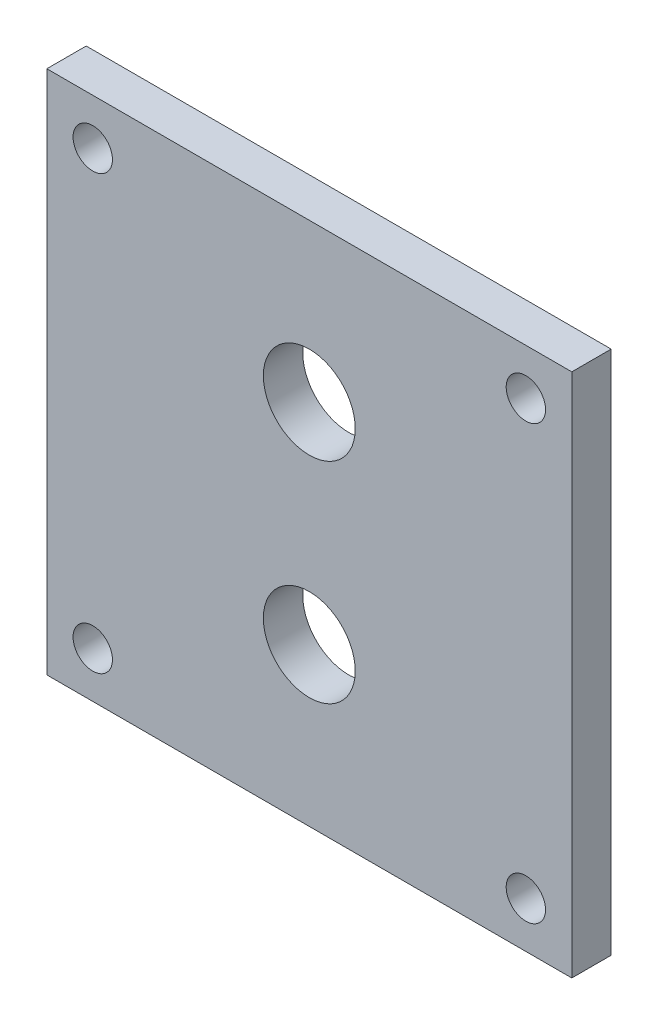
ISO-10303-21;
HEADER;
FILE_DESCRIPTION(('STEP AP214'),'2;1');
FILE_NAME('part.step','',(''),(''),'','','');
FILE_SCHEMA(('AUTOMOTIVE_DESIGN { 1 0 10303 214 1 1 1 1 }'));
ENDSEC;
DATA;
#1=APPLICATION_CONTEXT('core data for automotive mechanical design processes');
#2=APPLICATION_PROTOCOL_DEFINITION('international standard','automotive_design',2000,#1);
#3=PRODUCT_CONTEXT('',#1,'mechanical');
#4=PRODUCT('Part','Part','',(#3));
#5=PRODUCT_RELATED_PRODUCT_CATEGORY('part','',(#4));
#6=PRODUCT_DEFINITION_FORMATION('','',#4);
#7=PRODUCT_DEFINITION_CONTEXT('part definition',#1,'design');
#8=PRODUCT_DEFINITION('design','',#6,#7);
#9=PRODUCT_DEFINITION_SHAPE('','',#8);
#10=(LENGTH_UNIT() NAMED_UNIT(*) SI_UNIT(.MILLI.,.METRE.));
#11=(NAMED_UNIT(*) PLANE_ANGLE_UNIT() SI_UNIT($,.RADIAN.));
#12=(NAMED_UNIT(*) SI_UNIT($,.STERADIAN.) SOLID_ANGLE_UNIT());
#13=UNCERTAINTY_MEASURE_WITH_UNIT(LENGTH_MEASURE(1.E-05),#10,'distance_accuracy_value','');
#14=(GEOMETRIC_REPRESENTATION_CONTEXT(3) GLOBAL_UNCERTAINTY_ASSIGNED_CONTEXT((#13)) GLOBAL_UNIT_ASSIGNED_CONTEXT((#10,
#11,#12)) REPRESENTATION_CONTEXT('',''));
#15=CARTESIAN_POINT('',(0.,0.,0.));
#16=DIRECTION('',(0.,0.,1.));
#17=DIRECTION('',(1.,0.,0.));
#18=AXIS2_PLACEMENT_3D('',#15,#16,#17);
#19=CARTESIAN_POINT('',(63.5,63.5,9.525));
#20=DIRECTION('',(-1.,0.,0.));
#21=DIRECTION('',(0.,-1.,0.));
#22=AXIS2_PLACEMENT_3D('',#19,#20,#21);
#23=PLANE('',#22);
#24=DIRECTION('',(0.,1.,0.));
#25=VECTOR('',#24,1.);
#26=CARTESIAN_POINT('',(63.5,63.5,0.));
#27=LINE('',#26,#25);
#28=CARTESIAN_POINT('',(63.5,-63.5,0.));
#29=VERTEX_POINT('',#28);
#30=CARTESIAN_POINT('',(63.5,63.5,0.));
#31=VERTEX_POINT('',#30);
#32=EDGE_CURVE('E95',#29,#31,#27,.T.);
#33=ORIENTED_EDGE('',*,*,#32,.T.);
#34=DIRECTION('',(0.,0.,-1.));
#35=VECTOR('',#34,1.);
#36=CARTESIAN_POINT('',(63.5,63.5,9.525));
#37=LINE('',#36,#35);
#38=CARTESIAN_POINT('',(63.5,63.5,9.525));
#39=VERTEX_POINT('',#38);
#40=EDGE_CURVE('E11',#39,#31,#37,.T.);
#41=ORIENTED_EDGE('',*,*,#40,.F.);
#42=DIRECTION('',(0.,1.,0.));
#43=VECTOR('',#42,1.);
#44=CARTESIAN_POINT('',(63.5,63.5,9.525));
#45=LINE('',#44,#43);
#46=CARTESIAN_POINT('',(63.5,-63.5,9.525));
#47=VERTEX_POINT('',#46);
#48=EDGE_CURVE('E83',#47,#39,#45,.T.);
#49=ORIENTED_EDGE('',*,*,#48,.F.);
#50=DIRECTION('',(0.,0.,-1.));
#51=VECTOR('',#50,1.);
#52=CARTESIAN_POINT('',(63.5,-63.5,9.525));
#53=LINE('',#52,#51);
#54=EDGE_CURVE('E91',#47,#29,#53,.T.);
#55=ORIENTED_EDGE('',*,*,#54,.T.);
#56=EDGE_LOOP('',(#33,#41,#49,#55));
#57=FACE_BOUND('',#56,.T.);
#58=ADVANCED_FACE('F32',(#57),#23,.F.);
#59=CARTESIAN_POINT('',(-63.5,63.5,9.525));
#60=DIRECTION('',(0.,-1.,0.));
#61=DIRECTION('',(0.,0.,-1.));
#62=AXIS2_PLACEMENT_3D('',#59,#60,#61);
#63=PLANE('',#62);
#64=DIRECTION('',(-1.,0.,0.));
#65=VECTOR('',#64,1.);
#66=CARTESIAN_POINT('',(-63.5,63.5,0.));
#67=LINE('',#66,#65);
#68=CARTESIAN_POINT('',(-63.5,63.5,0.));
#69=VERTEX_POINT('',#68);
#70=EDGE_CURVE('E87',#31,#69,#67,.T.);
#71=ORIENTED_EDGE('',*,*,#70,.T.);
#72=DIRECTION('',(0.,0.,-1.));
#73=VECTOR('',#72,1.);
#74=CARTESIAN_POINT('',(-63.5,63.5,9.525));
#75=LINE('',#74,#73);
#76=CARTESIAN_POINT('',(-63.5,63.5,9.525));
#77=VERTEX_POINT('',#76);
#78=EDGE_CURVE('E40',#77,#69,#75,.T.);
#79=ORIENTED_EDGE('',*,*,#78,.F.);
#80=DIRECTION('',(-1.,0.,0.));
#81=VECTOR('',#80,1.);
#82=CARTESIAN_POINT('',(-63.5,63.5,9.525));
#83=LINE('',#82,#81);
#84=EDGE_CURVE('E78',#39,#77,#83,.T.);
#85=ORIENTED_EDGE('',*,*,#84,.F.);
#86=ORIENTED_EDGE('',*,*,#40,.T.);
#87=EDGE_LOOP('',(#71,#79,#85,#86));
#88=FACE_BOUND('',#87,.T.);
#89=ADVANCED_FACE('F86',(#88),#63,.F.);
#90=CARTESIAN_POINT('',(-63.5,63.5,9.525));
#91=DIRECTION('',(1.,0.,0.));
#92=DIRECTION('',(0.,1.,0.));
#93=AXIS2_PLACEMENT_3D('',#90,#91,#92);
#94=PLANE('',#93);
#95=DIRECTION('',(0.,-1.,0.));
#96=VECTOR('',#95,1.);
#97=CARTESIAN_POINT('',(-63.5,63.5,0.));
#98=LINE('',#97,#96);
#99=CARTESIAN_POINT('',(-63.5,-63.5,0.));
#100=VERTEX_POINT('',#99);
#101=EDGE_CURVE('E65',#69,#100,#98,.T.);
#102=ORIENTED_EDGE('',*,*,#101,.T.);
#103=DIRECTION('',(0.,0.,-1.));
#104=VECTOR('',#103,1.);
#105=CARTESIAN_POINT('',(-63.5,-63.5,9.525));
#106=LINE('',#105,#104);
#107=CARTESIAN_POINT('',(-63.5,-63.5,9.525));
#108=VERTEX_POINT('',#107);
#109=EDGE_CURVE('E88',#108,#100,#106,.T.);
#110=ORIENTED_EDGE('',*,*,#109,.F.);
#111=DIRECTION('',(0.,-1.,0.));
#112=VECTOR('',#111,1.);
#113=CARTESIAN_POINT('',(-63.5,63.5,9.525));
#114=LINE('',#113,#112);
#115=EDGE_CURVE('E81',#77,#108,#114,.T.);
#116=ORIENTED_EDGE('',*,*,#115,.F.);
#117=ORIENTED_EDGE('',*,*,#78,.T.);
#118=EDGE_LOOP('',(#102,#110,#116,#117));
#119=FACE_BOUND('',#118,.T.);
#120=ADVANCED_FACE('F89',(#119),#94,.F.);
#121=CARTESIAN_POINT('',(-63.5,-63.5,9.525));
#122=DIRECTION('',(0.,1.,0.));
#123=DIRECTION('',(0.,0.,1.));
#124=AXIS2_PLACEMENT_3D('',#121,#122,#123);
#125=PLANE('',#124);
#126=DIRECTION('',(1.,0.,0.));
#127=VECTOR('',#126,1.);
#128=CARTESIAN_POINT('',(-63.5,-63.5,0.));
#129=LINE('',#128,#127);
#130=EDGE_CURVE('E71',#100,#29,#129,.T.);
#131=ORIENTED_EDGE('',*,*,#130,.T.);
#132=ORIENTED_EDGE('',*,*,#54,.F.);
#133=DIRECTION('',(1.,0.,0.));
#134=VECTOR('',#133,1.);
#135=CARTESIAN_POINT('',(-63.5,-63.5,9.525));
#136=LINE('',#135,#134);
#137=EDGE_CURVE('E48',#108,#47,#136,.T.);
#138=ORIENTED_EDGE('',*,*,#137,.F.);
#139=ORIENTED_EDGE('',*,*,#109,.T.);
#140=EDGE_LOOP('',(#131,#132,#138,#139));
#141=FACE_BOUND('',#140,.T.);
#142=ADVANCED_FACE('F103',(#141),#125,.F.);
#143=CARTESIAN_POINT('',(0.,0.,9.525));
#144=DIRECTION('',(0.,0.,1.));
#145=DIRECTION('',(1.,0.,0.));
#146=AXIS2_PLACEMENT_3D('',#143,#144,#145);
#147=PLANE('',#146);
#148=CARTESIAN_POINT('',(52.3875,-52.3875,9.525));
#149=DIRECTION('',(0.,0.,1.));
#150=DIRECTION('',(1.,0.,0.));
#151=AXIS2_PLACEMENT_3D('',#148,#149,#150);
#152=CIRCLE('',#151,4.7625);
#153=CARTESIAN_POINT('',(47.625,-52.3875,9.525));
#154=VERTEX_POINT('',#153);
#155=EDGE_CURVE('E138',#154,#154,#152,.F.);
#156=ORIENTED_EDGE('',*,*,#155,.T.);
#157=EDGE_LOOP('',(#156));
#158=FACE_BOUND('',#157,.T.);
#159=CARTESIAN_POINT('',(52.3875,52.3875,9.525));
#160=DIRECTION('',(0.,0.,1.));
#161=DIRECTION('',(1.,0.,0.));
#162=AXIS2_PLACEMENT_3D('',#159,#160,#161);
#163=CIRCLE('',#162,4.7625);
#164=CARTESIAN_POINT('',(47.625,52.3875,9.525));
#165=VERTEX_POINT('',#164);
#166=EDGE_CURVE('E132',#165,#165,#163,.F.);
#167=ORIENTED_EDGE('',*,*,#166,.T.);
#168=EDGE_LOOP('',(#167));
#169=FACE_BOUND('',#168,.T.);
#170=CARTESIAN_POINT('',(-52.3875,-52.3875,9.525));
#171=DIRECTION('',(0.,0.,1.));
#172=DIRECTION('',(1.,0.,0.));
#173=AXIS2_PLACEMENT_3D('',#170,#171,#172);
#174=CIRCLE('',#173,4.7625);
#175=CARTESIAN_POINT('',(-57.15,-52.3875,9.525));
#176=VERTEX_POINT('',#175);
#177=EDGE_CURVE('E126',#176,#176,#174,.F.);
#178=ORIENTED_EDGE('',*,*,#177,.T.);
#179=EDGE_LOOP('',(#178));
#180=FACE_BOUND('',#179,.T.);
#181=CARTESIAN_POINT('',(-52.3875,52.3875,9.525));
#182=DIRECTION('',(0.,0.,1.));
#183=DIRECTION('',(1.,0.,0.));
#184=AXIS2_PLACEMENT_3D('',#181,#182,#183);
#185=CIRCLE('',#184,4.7625);
#186=CARTESIAN_POINT('',(-57.15,52.3875,9.525));
#187=VERTEX_POINT('',#186);
#188=EDGE_CURVE('E120',#187,#187,#185,.F.);
#189=ORIENTED_EDGE('',*,*,#188,.T.);
#190=EDGE_LOOP('',(#189));
#191=FACE_BOUND('',#190,.T.);
#192=CARTESIAN_POINT('',(0.,-25.4,9.525));
#193=DIRECTION('',(0.,0.,1.));
#194=DIRECTION('',(1.,0.,0.));
#195=AXIS2_PLACEMENT_3D('',#192,#193,#194);
#196=CIRCLE('',#195,11.1125);
#197=CARTESIAN_POINT('',(11.1125,-25.4,9.525));
#198=VERTEX_POINT('',#197);
#199=EDGE_CURVE('E114',#198,#198,#196,.F.);
#200=ORIENTED_EDGE('',*,*,#199,.T.);
#201=EDGE_LOOP('',(#200));
#202=FACE_BOUND('',#201,.T.);
#203=CARTESIAN_POINT('',(0.,25.4,9.525));
#204=DIRECTION('',(0.,0.,1.));
#205=DIRECTION('',(1.,0.,0.));
#206=AXIS2_PLACEMENT_3D('',#203,#204,#205);
#207=CIRCLE('',#206,11.1125);
#208=CARTESIAN_POINT('',(11.1125,25.4,9.525));
#209=VERTEX_POINT('',#208);
#210=EDGE_CURVE('E98',#209,#209,#207,.F.);
#211=ORIENTED_EDGE('',*,*,#210,.T.);
#212=EDGE_LOOP('',(#211));
#213=FACE_BOUND('',#212,.T.);
#214=ORIENTED_EDGE('',*,*,#48,.T.);
#215=ORIENTED_EDGE('',*,*,#84,.T.);
#216=ORIENTED_EDGE('',*,*,#115,.T.);
#217=ORIENTED_EDGE('',*,*,#137,.T.);
#218=EDGE_LOOP('',(#214,#215,#216,#217));
#219=FACE_BOUND('',#218,.T.);
#220=ADVANCED_FACE('F79',(#158,#169,#180,#191,#202,#213,#219),#147,.T.);
#221=CARTESIAN_POINT('',(0.,0.,0.));
#222=DIRECTION('',(0.,0.,1.));
#223=DIRECTION('',(1.,0.,0.));
#224=AXIS2_PLACEMENT_3D('',#221,#222,#223);
#225=PLANE('',#224);
#226=CARTESIAN_POINT('',(52.3875,-52.3875,0.));
#227=DIRECTION('',(0.,0.,-1.));
#228=DIRECTION('',(-1.,0.,0.));
#229=AXIS2_PLACEMENT_3D('',#226,#227,#228);
#230=CIRCLE('',#229,4.7625);
#231=CARTESIAN_POINT('',(47.625,-52.3875,0.));
#232=VERTEX_POINT('',#231);
#233=EDGE_CURVE('E141',#232,#232,#230,.T.);
#234=ORIENTED_EDGE('',*,*,#233,.F.);
#235=EDGE_LOOP('',(#234));
#236=FACE_BOUND('',#235,.T.);
#237=CARTESIAN_POINT('',(52.3875,52.3875,0.));
#238=DIRECTION('',(0.,0.,-1.));
#239=DIRECTION('',(1.,0.,0.));
#240=AXIS2_PLACEMENT_3D('',#237,#238,#239);
#241=CIRCLE('',#240,4.7625);
#242=CARTESIAN_POINT('',(47.625,52.3875,0.));
#243=VERTEX_POINT('',#242);
#244=EDGE_CURVE('E135',#243,#243,#241,.T.);
#245=ORIENTED_EDGE('',*,*,#244,.F.);
#246=EDGE_LOOP('',(#245));
#247=FACE_BOUND('',#246,.T.);
#248=CARTESIAN_POINT('',(-52.3875,-52.3875,0.));
#249=DIRECTION('',(0.,0.,-1.));
#250=DIRECTION('',(1.,0.,0.));
#251=AXIS2_PLACEMENT_3D('',#248,#249,#250);
#252=CIRCLE('',#251,4.7625);
#253=CARTESIAN_POINT('',(-57.15,-52.3875,0.));
#254=VERTEX_POINT('',#253);
#255=EDGE_CURVE('E129',#254,#254,#252,.T.);
#256=ORIENTED_EDGE('',*,*,#255,.F.);
#257=EDGE_LOOP('',(#256));
#258=FACE_BOUND('',#257,.T.);
#259=CARTESIAN_POINT('',(-52.3875,52.3875,0.));
#260=DIRECTION('',(0.,0.,-1.));
#261=DIRECTION('',(-1.,0.,0.));
#262=AXIS2_PLACEMENT_3D('',#259,#260,#261);
#263=CIRCLE('',#262,4.7625);
#264=CARTESIAN_POINT('',(-57.15,52.3875,0.));
#265=VERTEX_POINT('',#264);
#266=EDGE_CURVE('E123',#265,#265,#263,.T.);
#267=ORIENTED_EDGE('',*,*,#266,.F.);
#268=EDGE_LOOP('',(#267));
#269=FACE_BOUND('',#268,.T.);
#270=CARTESIAN_POINT('',(0.,-25.4,0.));
#271=DIRECTION('',(0.,0.,-1.));
#272=DIRECTION('',(-1.,0.,0.));
#273=AXIS2_PLACEMENT_3D('',#270,#271,#272);
#274=CIRCLE('',#273,11.1125);
#275=CARTESIAN_POINT('',(-11.1125,-25.4,0.));
#276=VERTEX_POINT('',#275);
#277=EDGE_CURVE('E117',#276,#276,#274,.T.);
#278=ORIENTED_EDGE('',*,*,#277,.F.);
#279=EDGE_LOOP('',(#278));
#280=FACE_BOUND('',#279,.T.);
#281=CARTESIAN_POINT('',(0.,25.4,0.));
#282=DIRECTION('',(0.,0.,-1.));
#283=DIRECTION('',(-1.,0.,0.));
#284=AXIS2_PLACEMENT_3D('',#281,#282,#283);
#285=CIRCLE('',#284,11.1125);
#286=CARTESIAN_POINT('',(-11.1125,25.4,0.));
#287=VERTEX_POINT('',#286);
#288=EDGE_CURVE('E111',#287,#287,#285,.T.);
#289=ORIENTED_EDGE('',*,*,#288,.F.);
#290=EDGE_LOOP('',(#289));
#291=FACE_BOUND('',#290,.T.);
#292=ORIENTED_EDGE('',*,*,#32,.F.);
#293=ORIENTED_EDGE('',*,*,#130,.F.);
#294=ORIENTED_EDGE('',*,*,#101,.F.);
#295=ORIENTED_EDGE('',*,*,#70,.F.);
#296=EDGE_LOOP('',(#292,#293,#294,#295));
#297=FACE_BOUND('',#296,.T.);
#298=ADVANCED_FACE('F106',(#236,#247,#258,#269,#280,#291,#297),#225,.F.);
#299=CARTESIAN_POINT('',(0.,25.4,40.955896423742));
#300=DIRECTION('',(0.,0.,-1.));
#301=DIRECTION('',(-1.,0.,0.));
#302=AXIS2_PLACEMENT_3D('',#299,#300,#301);
#303=CYLINDRICAL_SURFACE('',#302,11.1125);
#304=ORIENTED_EDGE('',*,*,#288,.T.);
#305=EDGE_LOOP('',(#304));
#306=FACE_BOUND('',#305,.T.);
#307=ORIENTED_EDGE('',*,*,#210,.F.);
#308=EDGE_LOOP('',(#307));
#309=FACE_BOUND('',#308,.T.);
#310=ADVANCED_FACE('F150',(#306,#309),#303,.F.);
#311=CARTESIAN_POINT('',(0.,-25.4,40.955896423742));
#312=DIRECTION('',(0.,0.,-1.));
#313=DIRECTION('',(-1.,0.,0.));
#314=AXIS2_PLACEMENT_3D('',#311,#312,#313);
#315=CYLINDRICAL_SURFACE('',#314,11.1125);
#316=ORIENTED_EDGE('',*,*,#277,.T.);
#317=EDGE_LOOP('',(#316));
#318=FACE_BOUND('',#317,.T.);
#319=ORIENTED_EDGE('',*,*,#199,.F.);
#320=EDGE_LOOP('',(#319));
#321=FACE_BOUND('',#320,.T.);
#322=ADVANCED_FACE('F164',(#318,#321),#315,.F.);
#323=CARTESIAN_POINT('',(-52.3875,52.3875,22.9953841816037));
#324=DIRECTION('',(0.,0.,-1.));
#325=DIRECTION('',(-1.,0.,0.));
#326=AXIS2_PLACEMENT_3D('',#323,#324,#325);
#327=CYLINDRICAL_SURFACE('',#326,4.7625);
#328=CARTESIAN_POINT('',(-57.15,52.3875,0.));
#329=CARTESIAN_POINT('',(-57.15,52.3875,0.0992187500000035));
#330=CARTESIAN_POINT('',(-57.15,52.3875,0.198437500000004));
#331=CARTESIAN_POINT('',(-57.15,52.3875,0.396875000000004));
#332=CARTESIAN_POINT('',(-57.15,52.3875,0.496093750000004));
#333=CARTESIAN_POINT('',(-57.15,52.3875,0.694531250000004));
#334=CARTESIAN_POINT('',(-57.15,52.3875,0.793750000000004));
#335=CARTESIAN_POINT('',(-57.15,52.3875,0.992187500000004));
#336=CARTESIAN_POINT('',(-57.15,52.3875,1.09140625));
#337=CARTESIAN_POINT('',(-57.15,52.3875,1.28984375));
#338=CARTESIAN_POINT('',(-57.15,52.3875,1.3890625));
#339=CARTESIAN_POINT('',(-57.15,52.3875,1.5875));
#340=CARTESIAN_POINT('',(-57.15,52.3875,1.68671875));
#341=CARTESIAN_POINT('',(-57.15,52.3875,1.88515625));
#342=CARTESIAN_POINT('',(-57.15,52.3875,1.984375));
#343=CARTESIAN_POINT('',(-57.15,52.3875,2.1828125));
#344=CARTESIAN_POINT('',(-57.15,52.3875,2.28203125000001));
#345=CARTESIAN_POINT('',(-57.15,52.3875,2.48046875));
#346=CARTESIAN_POINT('',(-57.15,52.3875,2.57968750000001));
#347=CARTESIAN_POINT('',(-57.15,52.3875,2.778125));
#348=CARTESIAN_POINT('',(-57.15,52.3875,2.87734375));
#349=CARTESIAN_POINT('',(-57.15,52.3875,3.07578125));
#350=CARTESIAN_POINT('',(-57.15,52.3875,3.175));
#351=CARTESIAN_POINT('',(-57.15,52.3875,3.3734375));
#352=CARTESIAN_POINT('',(-57.15,52.3875,3.47265625));
#353=CARTESIAN_POINT('',(-57.15,52.3875,3.67109375));
#354=CARTESIAN_POINT('',(-57.15,52.3875,3.7703125));
#355=CARTESIAN_POINT('',(-57.15,52.3875,3.96875));
#356=CARTESIAN_POINT('',(-57.15,52.3875,4.06796875));
#357=CARTESIAN_POINT('',(-57.15,52.3875,4.26640625));
#358=CARTESIAN_POINT('',(-57.15,52.3875,4.365625));
#359=CARTESIAN_POINT('',(-57.15,52.3875,4.5640625));
#360=CARTESIAN_POINT('',(-57.15,52.3875,4.66328125));
#361=CARTESIAN_POINT('',(-57.15,52.3875,4.86171875));
#362=CARTESIAN_POINT('',(-57.15,52.3875,4.9609375));
#363=CARTESIAN_POINT('',(-57.15,52.3875,5.159375));
#364=CARTESIAN_POINT('',(-57.15,52.3875,5.25859375));
#365=CARTESIAN_POINT('',(-57.15,52.3875,5.45703125));
#366=CARTESIAN_POINT('',(-57.15,52.3875,5.55625));
#367=CARTESIAN_POINT('',(-57.15,52.3875,5.7546875));
#368=CARTESIAN_POINT('',(-57.15,52.3875,5.85390625));
#369=CARTESIAN_POINT('',(-57.15,52.3875,6.05234375));
#370=CARTESIAN_POINT('',(-57.15,52.3875,6.1515625));
#371=CARTESIAN_POINT('',(-57.15,52.3875,6.35));
#372=CARTESIAN_POINT('',(-57.15,52.3875,6.44921875));
#373=CARTESIAN_POINT('',(-57.15,52.3875,6.64765625));
#374=CARTESIAN_POINT('',(-57.15,52.3875,6.746875));
#375=CARTESIAN_POINT('',(-57.15,52.3875,6.9453125));
#376=CARTESIAN_POINT('',(-57.15,52.3875,7.04453125));
#377=CARTESIAN_POINT('',(-57.15,52.3875,7.24296875));
#378=CARTESIAN_POINT('',(-57.15,52.3875,7.3421875));
#379=CARTESIAN_POINT('',(-57.15,52.3875,7.540625));
#380=CARTESIAN_POINT('',(-57.15,52.3875,7.63984375));
#381=CARTESIAN_POINT('',(-57.15,52.3875,7.83828125));
#382=CARTESIAN_POINT('',(-57.15,52.3875,7.9375));
#383=CARTESIAN_POINT('',(-57.15,52.3875,8.1359375));
#384=CARTESIAN_POINT('',(-57.15,52.3875,8.23515625));
#385=CARTESIAN_POINT('',(-57.15,52.3875,8.43359375));
#386=CARTESIAN_POINT('',(-57.15,52.3875,8.5328125));
#387=CARTESIAN_POINT('',(-57.15,52.3875,8.73125));
#388=CARTESIAN_POINT('',(-57.15,52.3875,8.83046875));
#389=CARTESIAN_POINT('',(-57.15,52.3875,9.02890625));
#390=CARTESIAN_POINT('',(-57.15,52.3875,9.128125));
#391=CARTESIAN_POINT('',(-57.15,52.3875,9.3265625));
#392=CARTESIAN_POINT('',(-57.15,52.3875,9.42578125));
#393=CARTESIAN_POINT('',(-57.15,52.3875,9.525));
#394=B_SPLINE_CURVE_WITH_KNOTS('',3,(#328,#329,#330,#331,#332,#333,#334,#335,#336,#337,#338,
#339,#340,#341,#342,#343,#344,#345,#346,#347,#348,#349,#350,#351,#352,#353,#354,#355,#356,#357,
#358,#359,#360,#361,#362,#363,#364,#365,#366,#367,#368,#369,#370,#371,#372,#373,#374,#375,#376,
#377,#378,#379,#380,#381,#382,#383,#384,#385,#386,#387,#388,#389,#390,#391,#392,#393),
.UNSPECIFIED.,.F.,.F.,(4,2,2,2,2,2,2,2,2,2,2,2,2,2,2,2,2,2,2,2,2,2,2,2,2,2,2,2,2,2,2,2,4),(0.,
0.29765625,0.5953125,0.892968750000001,1.190625,1.48828125,1.7859375,2.08359375,2.38125,
2.67890625,2.9765625,3.27421875,3.571875,3.86953125,4.1671875,4.46484375,4.7625,5.06015625,
5.3578125,5.65546875,5.953125,6.25078125,6.5484375,6.84609375,7.14375,7.44140625,7.7390625,
8.03671875,8.334375,8.63203125,8.9296875,9.22734375,9.525),.UNSPECIFIED.);
#395=EDGE_CURVE('BSEAM206',#265,#187,#394,.T.);
#396=ORIENTED_EDGE('',*,*,#266,.T.);
#397=ORIENTED_EDGE('',*,*,#188,.F.);
#398=ORIENTED_EDGE('',*,*,#395,.T.);
#399=ORIENTED_EDGE('',*,*,#395,.F.);
#400=EDGE_LOOP('',(#396,#398,#397,#399));
#401=FACE_BOUND('',#400,.T.);
#402=ADVANCED_FACE('F206',(#401),#327,.F.);
#403=CARTESIAN_POINT('',(-52.3875,-52.3875,22.9953841816037));
#404=DIRECTION('',(0.,0.,-1.));
#405=DIRECTION('',(-1.,0.,0.));
#406=AXIS2_PLACEMENT_3D('',#403,#404,#405);
#407=CYLINDRICAL_SURFACE('',#406,4.7625);
#408=CARTESIAN_POINT('',(-57.15,-52.3875,0.));
#409=CARTESIAN_POINT('',(-57.15,-52.3875,0.0992187500000035));
#410=CARTESIAN_POINT('',(-57.15,-52.3875,0.198437500000004));
#411=CARTESIAN_POINT('',(-57.15,-52.3875,0.396875000000004));
#412=CARTESIAN_POINT('',(-57.15,-52.3875,0.496093750000004));
#413=CARTESIAN_POINT('',(-57.15,-52.3875,0.694531250000004));
#414=CARTESIAN_POINT('',(-57.15,-52.3875,0.793750000000004));
#415=CARTESIAN_POINT('',(-57.15,-52.3875,0.992187500000004));
#416=CARTESIAN_POINT('',(-57.15,-52.3875,1.09140625));
#417=CARTESIAN_POINT('',(-57.15,-52.3875,1.28984375));
#418=CARTESIAN_POINT('',(-57.15,-52.3875,1.3890625));
#419=CARTESIAN_POINT('',(-57.15,-52.3875,1.5875));
#420=CARTESIAN_POINT('',(-57.15,-52.3875,1.68671875));
#421=CARTESIAN_POINT('',(-57.15,-52.3875,1.88515625));
#422=CARTESIAN_POINT('',(-57.15,-52.3875,1.984375));
#423=CARTESIAN_POINT('',(-57.15,-52.3875,2.1828125));
#424=CARTESIAN_POINT('',(-57.15,-52.3875,2.28203125000001));
#425=CARTESIAN_POINT('',(-57.15,-52.3875,2.48046875));
#426=CARTESIAN_POINT('',(-57.15,-52.3875,2.57968750000001));
#427=CARTESIAN_POINT('',(-57.15,-52.3875,2.778125));
#428=CARTESIAN_POINT('',(-57.15,-52.3875,2.87734375));
#429=CARTESIAN_POINT('',(-57.15,-52.3875,3.07578125));
#430=CARTESIAN_POINT('',(-57.15,-52.3875,3.175));
#431=CARTESIAN_POINT('',(-57.15,-52.3875,3.3734375));
#432=CARTESIAN_POINT('',(-57.15,-52.3875,3.47265625));
#433=CARTESIAN_POINT('',(-57.15,-52.3875,3.67109375));
#434=CARTESIAN_POINT('',(-57.15,-52.3875,3.7703125));
#435=CARTESIAN_POINT('',(-57.15,-52.3875,3.96875));
#436=CARTESIAN_POINT('',(-57.15,-52.3875,4.06796875));
#437=CARTESIAN_POINT('',(-57.15,-52.3875,4.26640625));
#438=CARTESIAN_POINT('',(-57.15,-52.3875,4.365625));
#439=CARTESIAN_POINT('',(-57.15,-52.3875,4.5640625));
#440=CARTESIAN_POINT('',(-57.15,-52.3875,4.66328125));
#441=CARTESIAN_POINT('',(-57.15,-52.3875,4.86171875));
#442=CARTESIAN_POINT('',(-57.15,-52.3875,4.9609375));
#443=CARTESIAN_POINT('',(-57.15,-52.3875,5.159375));
#444=CARTESIAN_POINT('',(-57.15,-52.3875,5.25859375));
#445=CARTESIAN_POINT('',(-57.15,-52.3875,5.45703125));
#446=CARTESIAN_POINT('',(-57.15,-52.3875,5.55625));
#447=CARTESIAN_POINT('',(-57.15,-52.3875,5.7546875));
#448=CARTESIAN_POINT('',(-57.15,-52.3875,5.85390625));
#449=CARTESIAN_POINT('',(-57.15,-52.3875,6.05234375));
#450=CARTESIAN_POINT('',(-57.15,-52.3875,6.1515625));
#451=CARTESIAN_POINT('',(-57.15,-52.3875,6.35));
#452=CARTESIAN_POINT('',(-57.15,-52.3875,6.44921875));
#453=CARTESIAN_POINT('',(-57.15,-52.3875,6.64765625));
#454=CARTESIAN_POINT('',(-57.15,-52.3875,6.746875));
#455=CARTESIAN_POINT('',(-57.15,-52.3875,6.9453125));
#456=CARTESIAN_POINT('',(-57.15,-52.3875,7.04453125));
#457=CARTESIAN_POINT('',(-57.15,-52.3875,7.24296875));
#458=CARTESIAN_POINT('',(-57.15,-52.3875,7.3421875));
#459=CARTESIAN_POINT('',(-57.15,-52.3875,7.540625));
#460=CARTESIAN_POINT('',(-57.15,-52.3875,7.63984375));
#461=CARTESIAN_POINT('',(-57.15,-52.3875,7.83828125));
#462=CARTESIAN_POINT('',(-57.15,-52.3875,7.9375));
#463=CARTESIAN_POINT('',(-57.15,-52.3875,8.1359375));
#464=CARTESIAN_POINT('',(-57.15,-52.3875,8.23515625));
#465=CARTESIAN_POINT('',(-57.15,-52.3875,8.43359375));
#466=CARTESIAN_POINT('',(-57.15,-52.3875,8.5328125));
#467=CARTESIAN_POINT('',(-57.15,-52.3875,8.73125));
#468=CARTESIAN_POINT('',(-57.15,-52.3875,8.83046875));
#469=CARTESIAN_POINT('',(-57.15,-52.3875,9.02890625));
#470=CARTESIAN_POINT('',(-57.15,-52.3875,9.128125));
#471=CARTESIAN_POINT('',(-57.15,-52.3875,9.3265625));
#472=CARTESIAN_POINT('',(-57.15,-52.3875,9.42578125));
#473=CARTESIAN_POINT('',(-57.15,-52.3875,9.525));
#474=B_SPLINE_CURVE_WITH_KNOTS('',3,(#408,#409,#410,#411,#412,#413,#414,#415,#416,#417,#418,
#419,#420,#421,#422,#423,#424,#425,#426,#427,#428,#429,#430,#431,#432,#433,#434,#435,#436,#437,
#438,#439,#440,#441,#442,#443,#444,#445,#446,#447,#448,#449,#450,#451,#452,#453,#454,#455,#456,
#457,#458,#459,#460,#461,#462,#463,#464,#465,#466,#467,#468,#469,#470,#471,#472,#473),
.UNSPECIFIED.,.F.,.F.,(4,2,2,2,2,2,2,2,2,2,2,2,2,2,2,2,2,2,2,2,2,2,2,2,2,2,2,2,2,2,2,2,4),(0.,
0.29765625,0.5953125,0.892968750000001,1.190625,1.48828125,1.7859375,2.08359375,2.38125,
2.67890625,2.9765625,3.27421875,3.571875,3.86953125,4.1671875,4.46484375,4.7625,5.06015625,
5.3578125,5.65546875,5.953125,6.25078125,6.5484375,6.84609375,7.14375,7.44140625,7.7390625,
8.03671875,8.334375,8.63203125,8.9296875,9.22734375,9.525),.UNSPECIFIED.);
#475=EDGE_CURVE('BSEAM225',#254,#176,#474,.T.);
#476=ORIENTED_EDGE('',*,*,#255,.T.);
#477=ORIENTED_EDGE('',*,*,#177,.F.);
#478=ORIENTED_EDGE('',*,*,#475,.T.);
#479=ORIENTED_EDGE('',*,*,#475,.F.);
#480=EDGE_LOOP('',(#476,#478,#477,#479));
#481=FACE_BOUND('',#480,.T.);
#482=ADVANCED_FACE('F225',(#481),#407,.F.);
#483=CARTESIAN_POINT('',(52.3875,52.3875,22.9953841816037));
#484=DIRECTION('',(0.,0.,-1.));
#485=DIRECTION('',(-1.,0.,0.));
#486=AXIS2_PLACEMENT_3D('',#483,#484,#485);
#487=CYLINDRICAL_SURFACE('',#486,4.7625);
#488=CARTESIAN_POINT('',(47.625,52.3875,0.));
#489=CARTESIAN_POINT('',(47.625,52.3875,0.0992187500000035));
#490=CARTESIAN_POINT('',(47.625,52.3875,0.198437500000004));
#491=CARTESIAN_POINT('',(47.625,52.3875,0.396875000000004));
#492=CARTESIAN_POINT('',(47.625,52.3875,0.496093750000004));
#493=CARTESIAN_POINT('',(47.625,52.3875,0.694531250000004));
#494=CARTESIAN_POINT('',(47.625,52.3875,0.793750000000004));
#495=CARTESIAN_POINT('',(47.625,52.3875,0.992187500000004));
#496=CARTESIAN_POINT('',(47.625,52.3875,1.09140625));
#497=CARTESIAN_POINT('',(47.625,52.3875,1.28984375));
#498=CARTESIAN_POINT('',(47.625,52.3875,1.3890625));
#499=CARTESIAN_POINT('',(47.625,52.3875,1.5875));
#500=CARTESIAN_POINT('',(47.625,52.3875,1.68671875));
#501=CARTESIAN_POINT('',(47.625,52.3875,1.88515625));
#502=CARTESIAN_POINT('',(47.625,52.3875,1.984375));
#503=CARTESIAN_POINT('',(47.625,52.3875,2.1828125));
#504=CARTESIAN_POINT('',(47.625,52.3875,2.28203125000001));
#505=CARTESIAN_POINT('',(47.625,52.3875,2.48046875));
#506=CARTESIAN_POINT('',(47.625,52.3875,2.57968750000001));
#507=CARTESIAN_POINT('',(47.625,52.3875,2.778125));
#508=CARTESIAN_POINT('',(47.625,52.3875,2.87734375));
#509=CARTESIAN_POINT('',(47.625,52.3875,3.07578125));
#510=CARTESIAN_POINT('',(47.625,52.3875,3.175));
#511=CARTESIAN_POINT('',(47.625,52.3875,3.3734375));
#512=CARTESIAN_POINT('',(47.625,52.3875,3.47265625));
#513=CARTESIAN_POINT('',(47.625,52.3875,3.67109375));
#514=CARTESIAN_POINT('',(47.625,52.3875,3.7703125));
#515=CARTESIAN_POINT('',(47.625,52.3875,3.96875));
#516=CARTESIAN_POINT('',(47.625,52.3875,4.06796875));
#517=CARTESIAN_POINT('',(47.625,52.3875,4.26640625));
#518=CARTESIAN_POINT('',(47.625,52.3875,4.365625));
#519=CARTESIAN_POINT('',(47.625,52.3875,4.5640625));
#520=CARTESIAN_POINT('',(47.625,52.3875,4.66328125));
#521=CARTESIAN_POINT('',(47.625,52.3875,4.86171875));
#522=CARTESIAN_POINT('',(47.625,52.3875,4.9609375));
#523=CARTESIAN_POINT('',(47.625,52.3875,5.159375));
#524=CARTESIAN_POINT('',(47.625,52.3875,5.25859375));
#525=CARTESIAN_POINT('',(47.625,52.3875,5.45703125));
#526=CARTESIAN_POINT('',(47.625,52.3875,5.55625));
#527=CARTESIAN_POINT('',(47.625,52.3875,5.7546875));
#528=CARTESIAN_POINT('',(47.625,52.3875,5.85390625));
#529=CARTESIAN_POINT('',(47.625,52.3875,6.05234375));
#530=CARTESIAN_POINT('',(47.625,52.3875,6.1515625));
#531=CARTESIAN_POINT('',(47.625,52.3875,6.35));
#532=CARTESIAN_POINT('',(47.625,52.3875,6.44921875));
#533=CARTESIAN_POINT('',(47.625,52.3875,6.64765625));
#534=CARTESIAN_POINT('',(47.625,52.3875,6.746875));
#535=CARTESIAN_POINT('',(47.625,52.3875,6.9453125));
#536=CARTESIAN_POINT('',(47.625,52.3875,7.04453125));
#537=CARTESIAN_POINT('',(47.625,52.3875,7.24296875));
#538=CARTESIAN_POINT('',(47.625,52.3875,7.3421875));
#539=CARTESIAN_POINT('',(47.625,52.3875,7.540625));
#540=CARTESIAN_POINT('',(47.625,52.3875,7.63984375));
#541=CARTESIAN_POINT('',(47.625,52.3875,7.83828125));
#542=CARTESIAN_POINT('',(47.625,52.3875,7.9375));
#543=CARTESIAN_POINT('',(47.625,52.3875,8.1359375));
#544=CARTESIAN_POINT('',(47.625,52.3875,8.23515625));
#545=CARTESIAN_POINT('',(47.625,52.3875,8.43359375));
#546=CARTESIAN_POINT('',(47.625,52.3875,8.5328125));
#547=CARTESIAN_POINT('',(47.625,52.3875,8.73125));
#548=CARTESIAN_POINT('',(47.625,52.3875,8.83046875));
#549=CARTESIAN_POINT('',(47.625,52.3875,9.02890625));
#550=CARTESIAN_POINT('',(47.625,52.3875,9.128125));
#551=CARTESIAN_POINT('',(47.625,52.3875,9.3265625));
#552=CARTESIAN_POINT('',(47.625,52.3875,9.42578125));
#553=CARTESIAN_POINT('',(47.625,52.3875,9.525));
#554=B_SPLINE_CURVE_WITH_KNOTS('',3,(#488,#489,#490,#491,#492,#493,#494,#495,#496,#497,#498,
#499,#500,#501,#502,#503,#504,#505,#506,#507,#508,#509,#510,#511,#512,#513,#514,#515,#516,#517,
#518,#519,#520,#521,#522,#523,#524,#525,#526,#527,#528,#529,#530,#531,#532,#533,#534,#535,#536,
#537,#538,#539,#540,#541,#542,#543,#544,#545,#546,#547,#548,#549,#550,#551,#552,#553),
.UNSPECIFIED.,.F.,.F.,(4,2,2,2,2,2,2,2,2,2,2,2,2,2,2,2,2,2,2,2,2,2,2,2,2,2,2,2,2,2,2,2,4),(0.,
0.29765625,0.5953125,0.892968750000001,1.190625,1.48828125,1.7859375,2.08359375,2.38125,
2.67890625,2.9765625,3.27421875,3.571875,3.86953125,4.1671875,4.46484375,4.7625,5.06015625,
5.3578125,5.65546875,5.953125,6.25078125,6.5484375,6.84609375,7.14375,7.44140625,7.7390625,
8.03671875,8.334375,8.63203125,8.9296875,9.22734375,9.525),.UNSPECIFIED.);
#555=EDGE_CURVE('BSEAM235',#243,#165,#554,.T.);
#556=ORIENTED_EDGE('',*,*,#244,.T.);
#557=ORIENTED_EDGE('',*,*,#166,.F.);
#558=ORIENTED_EDGE('',*,*,#555,.T.);
#559=ORIENTED_EDGE('',*,*,#555,.F.);
#560=EDGE_LOOP('',(#556,#558,#557,#559));
#561=FACE_BOUND('',#560,.T.);
#562=ADVANCED_FACE('F235',(#561),#487,.F.);
#563=CARTESIAN_POINT('',(52.3875,-52.3875,22.9953841816037));
#564=DIRECTION('',(0.,0.,-1.));
#565=DIRECTION('',(-1.,0.,0.));
#566=AXIS2_PLACEMENT_3D('',#563,#564,#565);
#567=CYLINDRICAL_SURFACE('',#566,4.7625);
#568=CARTESIAN_POINT('',(47.625,-52.3875,0.));
#569=CARTESIAN_POINT('',(47.625,-52.3875,0.0992187500000035));
#570=CARTESIAN_POINT('',(47.625,-52.3875,0.198437500000004));
#571=CARTESIAN_POINT('',(47.625,-52.3875,0.396875000000004));
#572=CARTESIAN_POINT('',(47.625,-52.3875,0.496093750000004));
#573=CARTESIAN_POINT('',(47.625,-52.3875,0.694531250000004));
#574=CARTESIAN_POINT('',(47.625,-52.3875,0.793750000000004));
#575=CARTESIAN_POINT('',(47.625,-52.3875,0.992187500000004));
#576=CARTESIAN_POINT('',(47.625,-52.3875,1.09140625));
#577=CARTESIAN_POINT('',(47.625,-52.3875,1.28984375));
#578=CARTESIAN_POINT('',(47.625,-52.3875,1.3890625));
#579=CARTESIAN_POINT('',(47.625,-52.3875,1.5875));
#580=CARTESIAN_POINT('',(47.625,-52.3875,1.68671875));
#581=CARTESIAN_POINT('',(47.625,-52.3875,1.88515625));
#582=CARTESIAN_POINT('',(47.625,-52.3875,1.984375));
#583=CARTESIAN_POINT('',(47.625,-52.3875,2.1828125));
#584=CARTESIAN_POINT('',(47.625,-52.3875,2.28203125000001));
#585=CARTESIAN_POINT('',(47.625,-52.3875,2.48046875));
#586=CARTESIAN_POINT('',(47.625,-52.3875,2.57968750000001));
#587=CARTESIAN_POINT('',(47.625,-52.3875,2.778125));
#588=CARTESIAN_POINT('',(47.625,-52.3875,2.87734375));
#589=CARTESIAN_POINT('',(47.625,-52.3875,3.07578125));
#590=CARTESIAN_POINT('',(47.625,-52.3875,3.175));
#591=CARTESIAN_POINT('',(47.625,-52.3875,3.3734375));
#592=CARTESIAN_POINT('',(47.625,-52.3875,3.47265625));
#593=CARTESIAN_POINT('',(47.625,-52.3875,3.67109375));
#594=CARTESIAN_POINT('',(47.625,-52.3875,3.7703125));
#595=CARTESIAN_POINT('',(47.625,-52.3875,3.96875));
#596=CARTESIAN_POINT('',(47.625,-52.3875,4.06796875));
#597=CARTESIAN_POINT('',(47.625,-52.3875,4.26640625));
#598=CARTESIAN_POINT('',(47.625,-52.3875,4.365625));
#599=CARTESIAN_POINT('',(47.625,-52.3875,4.5640625));
#600=CARTESIAN_POINT('',(47.625,-52.3875,4.66328125));
#601=CARTESIAN_POINT('',(47.625,-52.3875,4.86171875));
#602=CARTESIAN_POINT('',(47.625,-52.3875,4.9609375));
#603=CARTESIAN_POINT('',(47.625,-52.3875,5.159375));
#604=CARTESIAN_POINT('',(47.625,-52.3875,5.25859375));
#605=CARTESIAN_POINT('',(47.625,-52.3875,5.45703125));
#606=CARTESIAN_POINT('',(47.625,-52.3875,5.55625));
#607=CARTESIAN_POINT('',(47.625,-52.3875,5.7546875));
#608=CARTESIAN_POINT('',(47.625,-52.3875,5.85390625));
#609=CARTESIAN_POINT('',(47.625,-52.3875,6.05234375));
#610=CARTESIAN_POINT('',(47.625,-52.3875,6.1515625));
#611=CARTESIAN_POINT('',(47.625,-52.3875,6.35));
#612=CARTESIAN_POINT('',(47.625,-52.3875,6.44921875));
#613=CARTESIAN_POINT('',(47.625,-52.3875,6.64765625));
#614=CARTESIAN_POINT('',(47.625,-52.3875,6.746875));
#615=CARTESIAN_POINT('',(47.625,-52.3875,6.9453125));
#616=CARTESIAN_POINT('',(47.625,-52.3875,7.04453125));
#617=CARTESIAN_POINT('',(47.625,-52.3875,7.24296875));
#618=CARTESIAN_POINT('',(47.625,-52.3875,7.3421875));
#619=CARTESIAN_POINT('',(47.625,-52.3875,7.540625));
#620=CARTESIAN_POINT('',(47.625,-52.3875,7.63984375));
#621=CARTESIAN_POINT('',(47.625,-52.3875,7.83828125));
#622=CARTESIAN_POINT('',(47.625,-52.3875,7.9375));
#623=CARTESIAN_POINT('',(47.625,-52.3875,8.1359375));
#624=CARTESIAN_POINT('',(47.625,-52.3875,8.23515625));
#625=CARTESIAN_POINT('',(47.625,-52.3875,8.43359375));
#626=CARTESIAN_POINT('',(47.625,-52.3875,8.5328125));
#627=CARTESIAN_POINT('',(47.625,-52.3875,8.73125));
#628=CARTESIAN_POINT('',(47.625,-52.3875,8.83046875));
#629=CARTESIAN_POINT('',(47.625,-52.3875,9.02890625));
#630=CARTESIAN_POINT('',(47.625,-52.3875,9.128125));
#631=CARTESIAN_POINT('',(47.625,-52.3875,9.3265625));
#632=CARTESIAN_POINT('',(47.625,-52.3875,9.42578125));
#633=CARTESIAN_POINT('',(47.625,-52.3875,9.525));
#634=B_SPLINE_CURVE_WITH_KNOTS('',3,(#568,#569,#570,#571,#572,#573,#574,#575,#576,#577,#578,
#579,#580,#581,#582,#583,#584,#585,#586,#587,#588,#589,#590,#591,#592,#593,#594,#595,#596,#597,
#598,#599,#600,#601,#602,#603,#604,#605,#606,#607,#608,#609,#610,#611,#612,#613,#614,#615,#616,
#617,#618,#619,#620,#621,#622,#623,#624,#625,#626,#627,#628,#629,#630,#631,#632,#633),
.UNSPECIFIED.,.F.,.F.,(4,2,2,2,2,2,2,2,2,2,2,2,2,2,2,2,2,2,2,2,2,2,2,2,2,2,2,2,2,2,2,2,4),(0.,
0.29765625,0.5953125,0.892968750000001,1.190625,1.48828125,1.7859375,2.08359375,2.38125,
2.67890625,2.9765625,3.27421875,3.571875,3.86953125,4.1671875,4.46484375,4.7625,5.06015625,
5.3578125,5.65546875,5.953125,6.25078125,6.5484375,6.84609375,7.14375,7.44140625,7.7390625,
8.03671875,8.334375,8.63203125,8.9296875,9.22734375,9.525),.UNSPECIFIED.);
#635=EDGE_CURVE('BSEAM145',#232,#154,#634,.T.);
#636=ORIENTED_EDGE('',*,*,#233,.T.);
#637=ORIENTED_EDGE('',*,*,#155,.F.);
#638=ORIENTED_EDGE('',*,*,#635,.T.);
#639=ORIENTED_EDGE('',*,*,#635,.F.);
#640=EDGE_LOOP('',(#636,#638,#637,#639));
#641=FACE_BOUND('',#640,.T.);
#642=ADVANCED_FACE('F145',(#641),#567,.F.);
#643=CLOSED_SHELL('',(#58,#89,#120,#142,#220,#298,#310,#322,#402,#482,#562,#642));
#644=MANIFOLD_SOLID_BREP('B2',#643);
#645=ADVANCED_BREP_SHAPE_REPRESENTATION('',(#18,#644),#14);
#646=SHAPE_DEFINITION_REPRESENTATION(#9,#645);
ENDSEC;
END-ISO-10303-21;
